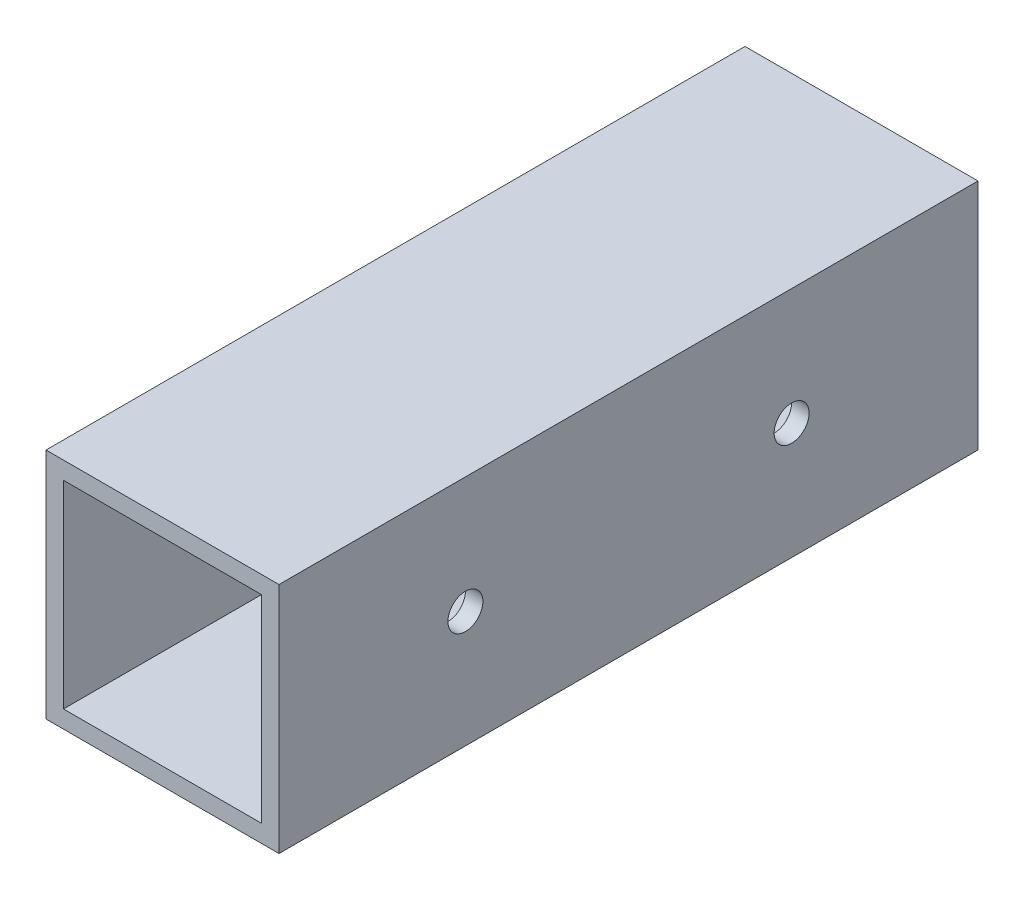
ISO-10303-21;
HEADER;
FILE_DESCRIPTION(('STEP AP214'),'2;1');
FILE_NAME('part.step','',(''),(''),'','','');
FILE_SCHEMA(('AUTOMOTIVE_DESIGN { 1 0 10303 214 1 1 1 1 }'));
ENDSEC;
DATA;
#1=APPLICATION_CONTEXT('core data for automotive mechanical design processes');
#2=APPLICATION_PROTOCOL_DEFINITION('international standard','automotive_design',2000,#1);
#3=PRODUCT_CONTEXT('',#1,'mechanical');
#4=PRODUCT('Part','Part','',(#3));
#5=PRODUCT_RELATED_PRODUCT_CATEGORY('part','',(#4));
#6=PRODUCT_DEFINITION_FORMATION('','',#4);
#7=PRODUCT_DEFINITION_CONTEXT('part definition',#1,'design');
#8=PRODUCT_DEFINITION('design','',#6,#7);
#9=PRODUCT_DEFINITION_SHAPE('','',#8);
#10=(LENGTH_UNIT() NAMED_UNIT(*) SI_UNIT(.MILLI.,.METRE.));
#11=(NAMED_UNIT(*) PLANE_ANGLE_UNIT() SI_UNIT($,.RADIAN.));
#12=(NAMED_UNIT(*) SI_UNIT($,.STERADIAN.) SOLID_ANGLE_UNIT());
#13=UNCERTAINTY_MEASURE_WITH_UNIT(LENGTH_MEASURE(1.E-05),#10,'distance_accuracy_value','');
#14=(GEOMETRIC_REPRESENTATION_CONTEXT(3) GLOBAL_UNCERTAINTY_ASSIGNED_CONTEXT((#13)) GLOBAL_UNIT_ASSIGNED_CONTEXT((#10,
#11,#12)) REPRESENTATION_CONTEXT('',''));
#15=CARTESIAN_POINT('',(0.,0.,0.));
#16=DIRECTION('',(0.,0.,1.));
#17=DIRECTION('',(1.,0.,0.));
#18=AXIS2_PLACEMENT_3D('',#15,#16,#17);
#19=CARTESIAN_POINT('',(0.,0.,60.));
#20=DIRECTION('',(0.,0.,-1.));
#21=DIRECTION('',(-1.,0.,0.));
#22=AXIS2_PLACEMENT_3D('',#19,#20,#21);
#23=PLANE('',#22);
#24=DIRECTION('',(0.,1.,0.));
#25=VECTOR('',#24,1.);
#26=CARTESIAN_POINT('',(10.,-10.,60.));
#27=LINE('',#26,#25);
#28=CARTESIAN_POINT('',(10.,-10.,60.));
#29=VERTEX_POINT('',#28);
#30=CARTESIAN_POINT('',(10.,10.,60.));
#31=VERTEX_POINT('',#30);
#32=EDGE_CURVE('E162',#29,#31,#27,.T.);
#33=ORIENTED_EDGE('',*,*,#32,.T.);
#34=DIRECTION('',(-1.,0.,0.));
#35=VECTOR('',#34,1.);
#36=CARTESIAN_POINT('',(-10.,10.,60.));
#37=LINE('',#36,#35);
#38=CARTESIAN_POINT('',(-10.,10.,60.));
#39=VERTEX_POINT('',#38);
#40=EDGE_CURVE('E166',#31,#39,#37,.T.);
#41=ORIENTED_EDGE('',*,*,#40,.T.);
#42=DIRECTION('',(0.,-1.,0.));
#43=VECTOR('',#42,1.);
#44=CARTESIAN_POINT('',(-10.,-10.,60.));
#45=LINE('',#44,#43);
#46=CARTESIAN_POINT('',(-10.,-10.,60.));
#47=VERTEX_POINT('',#46);
#48=EDGE_CURVE('E170',#39,#47,#45,.T.);
#49=ORIENTED_EDGE('',*,*,#48,.T.);
#50=DIRECTION('',(1.,0.,0.));
#51=VECTOR('',#50,1.);
#52=CARTESIAN_POINT('',(-10.,-10.,60.));
#53=LINE('',#52,#51);
#54=EDGE_CURVE('E173',#47,#29,#53,.T.);
#55=ORIENTED_EDGE('',*,*,#54,.T.);
#56=EDGE_LOOP('',(#33,#41,#49,#55));
#57=FACE_BOUND('',#56,.T.);
#58=DIRECTION('',(1.,0.,0.));
#59=VECTOR('',#58,1.);
#60=CARTESIAN_POINT('',(-8.5,-8.5,60.));
#61=LINE('',#60,#59);
#62=CARTESIAN_POINT('',(-8.5,-8.5,60.));
#63=VERTEX_POINT('',#62);
#64=CARTESIAN_POINT('',(8.5,-8.5,60.));
#65=VERTEX_POINT('',#64);
#66=EDGE_CURVE('E111',#63,#65,#61,.T.);
#67=ORIENTED_EDGE('',*,*,#66,.F.);
#68=DIRECTION('',(0.,-1.,0.));
#69=VECTOR('',#68,1.);
#70=CARTESIAN_POINT('',(-8.5,-8.5,60.));
#71=LINE('',#70,#69);
#72=CARTESIAN_POINT('',(-8.5,8.5,60.));
#73=VERTEX_POINT('',#72);
#74=EDGE_CURVE('E138',#73,#63,#71,.T.);
#75=ORIENTED_EDGE('',*,*,#74,.F.);
#76=DIRECTION('',(-1.,0.,0.));
#77=VECTOR('',#76,1.);
#78=CARTESIAN_POINT('',(-8.5,8.5,60.));
#79=LINE('',#78,#77);
#80=CARTESIAN_POINT('',(8.5,8.5,60.));
#81=VERTEX_POINT('',#80);
#82=EDGE_CURVE('E133',#81,#73,#79,.T.);
#83=ORIENTED_EDGE('',*,*,#82,.F.);
#84=DIRECTION('',(0.,1.,0.));
#85=VECTOR('',#84,1.);
#86=CARTESIAN_POINT('',(8.5,-8.5,60.));
#87=LINE('',#86,#85);
#88=EDGE_CURVE('E120',#65,#81,#87,.T.);
#89=ORIENTED_EDGE('',*,*,#88,.F.);
#90=EDGE_LOOP('',(#67,#75,#83,#89));
#91=FACE_BOUND('',#90,.T.);
#92=ADVANCED_FACE('F23',(#57,#91),#23,.F.);
#93=CARTESIAN_POINT('',(0.,0.,0.));
#94=DIRECTION('',(0.,0.,-1.));
#95=DIRECTION('',(-1.,0.,0.));
#96=AXIS2_PLACEMENT_3D('',#93,#94,#95);
#97=PLANE('',#96);
#98=DIRECTION('',(0.,1.,0.));
#99=VECTOR('',#98,1.);
#100=CARTESIAN_POINT('',(10.,-10.,0.));
#101=LINE('',#100,#99);
#102=CARTESIAN_POINT('',(10.,-10.,0.));
#103=VERTEX_POINT('',#102);
#104=CARTESIAN_POINT('',(10.,10.,0.));
#105=VERTEX_POINT('',#104);
#106=EDGE_CURVE('E129',#103,#105,#101,.T.);
#107=ORIENTED_EDGE('',*,*,#106,.F.);
#108=DIRECTION('',(1.,0.,0.));
#109=VECTOR('',#108,1.);
#110=CARTESIAN_POINT('',(-10.,-10.,0.));
#111=LINE('',#110,#109);
#112=CARTESIAN_POINT('',(-10.,-10.,0.));
#113=VERTEX_POINT('',#112);
#114=EDGE_CURVE('E167',#113,#103,#111,.T.);
#115=ORIENTED_EDGE('',*,*,#114,.F.);
#116=DIRECTION('',(0.,-1.,0.));
#117=VECTOR('',#116,1.);
#118=CARTESIAN_POINT('',(-10.,-10.,0.));
#119=LINE('',#118,#117);
#120=CARTESIAN_POINT('',(-10.,10.,0.));
#121=VERTEX_POINT('',#120);
#122=EDGE_CURVE('E183',#121,#113,#119,.T.);
#123=ORIENTED_EDGE('',*,*,#122,.F.);
#124=DIRECTION('',(-1.,0.,0.));
#125=VECTOR('',#124,1.);
#126=CARTESIAN_POINT('',(-10.,10.,0.));
#127=LINE('',#126,#125);
#128=EDGE_CURVE('E180',#105,#121,#127,.T.);
#129=ORIENTED_EDGE('',*,*,#128,.F.);
#130=EDGE_LOOP('',(#107,#115,#123,#129));
#131=FACE_BOUND('',#130,.T.);
#132=DIRECTION('',(0.,-1.,0.));
#133=VECTOR('',#132,1.);
#134=CARTESIAN_POINT('',(-8.5,-8.5,0.));
#135=LINE('',#134,#133);
#136=CARTESIAN_POINT('',(-8.5,8.5,0.));
#137=VERTEX_POINT('',#136);
#138=CARTESIAN_POINT('',(-8.5,-8.5,0.));
#139=VERTEX_POINT('',#138);
#140=EDGE_CURVE('E121',#137,#139,#135,.T.);
#141=ORIENTED_EDGE('',*,*,#140,.T.);
#142=DIRECTION('',(1.,0.,0.));
#143=VECTOR('',#142,1.);
#144=CARTESIAN_POINT('',(-8.5,-8.5,0.));
#145=LINE('',#144,#143);
#146=CARTESIAN_POINT('',(8.5,-8.5,0.));
#147=VERTEX_POINT('',#146);
#148=EDGE_CURVE('E55',#139,#147,#145,.T.);
#149=ORIENTED_EDGE('',*,*,#148,.T.);
#150=DIRECTION('',(0.,1.,0.));
#151=VECTOR('',#150,1.);
#152=CARTESIAN_POINT('',(8.5,-8.5,0.));
#153=LINE('',#152,#151);
#154=CARTESIAN_POINT('',(8.5,8.5,0.));
#155=VERTEX_POINT('',#154);
#156=EDGE_CURVE('E127',#147,#155,#153,.T.);
#157=ORIENTED_EDGE('',*,*,#156,.T.);
#158=DIRECTION('',(-1.,0.,0.));
#159=VECTOR('',#158,1.);
#160=CARTESIAN_POINT('',(-8.5,8.5,0.));
#161=LINE('',#160,#159);
#162=EDGE_CURVE('E149',#155,#137,#161,.T.);
#163=ORIENTED_EDGE('',*,*,#162,.T.);
#164=EDGE_LOOP('',(#141,#149,#157,#163));
#165=FACE_BOUND('',#164,.T.);
#166=ADVANCED_FACE('F245',(#131,#165),#97,.T.);
#167=CARTESIAN_POINT('',(10.,-10.,60.));
#168=DIRECTION('',(-1.,0.,0.));
#169=DIRECTION('',(0.,0.,1.));
#170=AXIS2_PLACEMENT_3D('',#167,#168,#169);
#171=PLANE('',#170);
#172=CARTESIAN_POINT('',(10.,0.,44.));
#173=DIRECTION('',(1.,0.,0.));
#174=DIRECTION('',(0.,0.,-1.));
#175=AXIS2_PLACEMENT_3D('',#172,#173,#174);
#176=CIRCLE('',#175,1.5);
#177=CARTESIAN_POINT('',(10.,0.,42.5));
#178=VERTEX_POINT('',#177);
#179=EDGE_CURVE('E301',#178,#178,#176,.T.);
#180=ORIENTED_EDGE('',*,*,#179,.F.);
#181=EDGE_LOOP('',(#180));
#182=FACE_BOUND('',#181,.T.);
#183=CARTESIAN_POINT('',(10.,0.,16.));
#184=DIRECTION('',(1.,0.,0.));
#185=DIRECTION('',(0.,0.,-1.));
#186=AXIS2_PLACEMENT_3D('',#183,#184,#185);
#187=CIRCLE('',#186,1.5);
#188=CARTESIAN_POINT('',(10.,0.,14.5));
#189=VERTEX_POINT('',#188);
#190=EDGE_CURVE('E201',#189,#189,#187,.T.);
#191=ORIENTED_EDGE('',*,*,#190,.F.);
#192=EDGE_LOOP('',(#191));
#193=FACE_BOUND('',#192,.T.);
#194=ORIENTED_EDGE('',*,*,#106,.T.);
#195=DIRECTION('',(0.,0.,-1.));
#196=VECTOR('',#195,1.);
#197=CARTESIAN_POINT('',(10.,10.,60.));
#198=LINE('',#197,#196);
#199=EDGE_CURVE('E13',#31,#105,#198,.T.);
#200=ORIENTED_EDGE('',*,*,#199,.F.);
#201=ORIENTED_EDGE('',*,*,#32,.F.);
#202=DIRECTION('',(0.,0.,-1.));
#203=VECTOR('',#202,1.);
#204=CARTESIAN_POINT('',(10.,-10.,60.));
#205=LINE('',#204,#203);
#206=EDGE_CURVE('E176',#29,#103,#205,.T.);
#207=ORIENTED_EDGE('',*,*,#206,.T.);
#208=EDGE_LOOP('',(#194,#200,#201,#207));
#209=FACE_BOUND('',#208,.T.);
#210=ADVANCED_FACE('F25',(#182,#193,#209),#171,.F.);
#211=CARTESIAN_POINT('',(-10.,10.,60.));
#212=DIRECTION('',(0.,-1.,0.));
#213=DIRECTION('',(1.,0.,0.));
#214=AXIS2_PLACEMENT_3D('',#211,#212,#213);
#215=PLANE('',#214);
#216=ORIENTED_EDGE('',*,*,#128,.T.);
#217=DIRECTION('',(0.,0.,-1.));
#218=VECTOR('',#217,1.);
#219=CARTESIAN_POINT('',(-10.,10.,60.));
#220=LINE('',#219,#218);
#221=EDGE_CURVE('E33',#39,#121,#220,.T.);
#222=ORIENTED_EDGE('',*,*,#221,.F.);
#223=ORIENTED_EDGE('',*,*,#40,.F.);
#224=ORIENTED_EDGE('',*,*,#199,.T.);
#225=EDGE_LOOP('',(#216,#222,#223,#224));
#226=FACE_BOUND('',#225,.T.);
#227=ADVANCED_FACE('F261',(#226),#215,.F.);
#228=CARTESIAN_POINT('',(-10.,-10.,60.));
#229=DIRECTION('',(1.,0.,0.));
#230=DIRECTION('',(0.,0.,-1.));
#231=AXIS2_PLACEMENT_3D('',#228,#229,#230);
#232=PLANE('',#231);
#233=CARTESIAN_POINT('',(-10.,0.,44.));
#234=DIRECTION('',(1.,0.,0.));
#235=DIRECTION('',(0.,0.,-1.));
#236=AXIS2_PLACEMENT_3D('',#233,#234,#235);
#237=CIRCLE('',#236,1.5);
#238=CARTESIAN_POINT('',(-10.,0.,42.5));
#239=VERTEX_POINT('',#238);
#240=EDGE_CURVE('E210',#239,#239,#237,.T.);
#241=ORIENTED_EDGE('',*,*,#240,.T.);
#242=EDGE_LOOP('',(#241));
#243=FACE_BOUND('',#242,.T.);
#244=CARTESIAN_POINT('',(-10.,0.,16.));
#245=DIRECTION('',(1.,0.,0.));
#246=DIRECTION('',(0.,0.,-1.));
#247=AXIS2_PLACEMENT_3D('',#244,#245,#246);
#248=CIRCLE('',#247,1.5);
#249=CARTESIAN_POINT('',(-10.,0.,14.5));
#250=VERTEX_POINT('',#249);
#251=EDGE_CURVE('E146',#250,#250,#248,.T.);
#252=ORIENTED_EDGE('',*,*,#251,.T.);
#253=EDGE_LOOP('',(#252));
#254=FACE_BOUND('',#253,.T.);
#255=ORIENTED_EDGE('',*,*,#122,.T.);
#256=DIRECTION('',(0.,0.,-1.));
#257=VECTOR('',#256,1.);
#258=CARTESIAN_POINT('',(-10.,-10.,60.));
#259=LINE('',#258,#257);
#260=EDGE_CURVE('E191',#47,#113,#259,.T.);
#261=ORIENTED_EDGE('',*,*,#260,.F.);
#262=ORIENTED_EDGE('',*,*,#48,.F.);
#263=ORIENTED_EDGE('',*,*,#221,.T.);
#264=EDGE_LOOP('',(#255,#261,#262,#263));
#265=FACE_BOUND('',#264,.T.);
#266=ADVANCED_FACE('F225',(#243,#254,#265),#232,.F.);
#267=CARTESIAN_POINT('',(-10.,-10.,60.));
#268=DIRECTION('',(0.,1.,0.));
#269=DIRECTION('',(-1.,0.,0.));
#270=AXIS2_PLACEMENT_3D('',#267,#268,#269);
#271=PLANE('',#270);
#272=ORIENTED_EDGE('',*,*,#114,.T.);
#273=ORIENTED_EDGE('',*,*,#206,.F.);
#274=ORIENTED_EDGE('',*,*,#54,.F.);
#275=ORIENTED_EDGE('',*,*,#260,.T.);
#276=EDGE_LOOP('',(#272,#273,#274,#275));
#277=FACE_BOUND('',#276,.T.);
#278=ADVANCED_FACE('F256',(#277),#271,.F.);
#279=CARTESIAN_POINT('',(-8.5,-8.5,60.));
#280=DIRECTION('',(0.,1.,0.));
#281=DIRECTION('',(0.,0.,1.));
#282=AXIS2_PLACEMENT_3D('',#279,#280,#281);
#283=PLANE('',#282);
#284=ORIENTED_EDGE('',*,*,#148,.F.);
#285=DIRECTION('',(0.,0.,-1.));
#286=VECTOR('',#285,1.);
#287=CARTESIAN_POINT('',(-8.5,-8.5,60.));
#288=LINE('',#287,#286);
#289=EDGE_CURVE('E115',#63,#139,#288,.T.);
#290=ORIENTED_EDGE('',*,*,#289,.F.);
#291=ORIENTED_EDGE('',*,*,#66,.T.);
#292=DIRECTION('',(0.,0.,-1.));
#293=VECTOR('',#292,1.);
#294=CARTESIAN_POINT('',(8.5,-8.5,60.));
#295=LINE('',#294,#293);
#296=EDGE_CURVE('E114',#65,#147,#295,.T.);
#297=ORIENTED_EDGE('',*,*,#296,.T.);
#298=EDGE_LOOP('',(#284,#290,#291,#297));
#299=FACE_BOUND('',#298,.T.);
#300=ADVANCED_FACE('F113',(#299),#283,.T.);
#301=CARTESIAN_POINT('',(8.5,-8.5,60.));
#302=DIRECTION('',(-1.,0.,0.));
#303=DIRECTION('',(0.,0.,1.));
#304=AXIS2_PLACEMENT_3D('',#301,#302,#303);
#305=PLANE('',#304);
#306=CARTESIAN_POINT('',(8.5,0.,44.));
#307=DIRECTION('',(-1.,0.,0.));
#308=DIRECTION('',(0.,0.,1.));
#309=AXIS2_PLACEMENT_3D('',#306,#307,#308);
#310=CIRCLE('',#309,1.5);
#311=CARTESIAN_POINT('',(8.5,0.,45.5));
#312=VERTEX_POINT('',#311);
#313=EDGE_CURVE('E217',#312,#312,#310,.T.);
#314=ORIENTED_EDGE('',*,*,#313,.F.);
#315=EDGE_LOOP('',(#314));
#316=FACE_BOUND('',#315,.T.);
#317=CARTESIAN_POINT('',(8.5,0.,16.));
#318=DIRECTION('',(-1.,0.,0.));
#319=DIRECTION('',(0.,0.,1.));
#320=AXIS2_PLACEMENT_3D('',#317,#318,#319);
#321=CIRCLE('',#320,1.5);
#322=CARTESIAN_POINT('',(8.5,0.,17.5));
#323=VERTEX_POINT('',#322);
#324=EDGE_CURVE('E200',#323,#323,#321,.T.);
#325=ORIENTED_EDGE('',*,*,#324,.F.);
#326=EDGE_LOOP('',(#325));
#327=FACE_BOUND('',#326,.T.);
#328=ORIENTED_EDGE('',*,*,#156,.F.);
#329=ORIENTED_EDGE('',*,*,#296,.F.);
#330=ORIENTED_EDGE('',*,*,#88,.T.);
#331=DIRECTION('',(0.,0.,-1.));
#332=VECTOR('',#331,1.);
#333=CARTESIAN_POINT('',(8.5,8.5,60.));
#334=LINE('',#333,#332);
#335=EDGE_CURVE('E130',#81,#155,#334,.T.);
#336=ORIENTED_EDGE('',*,*,#335,.T.);
#337=EDGE_LOOP('',(#328,#329,#330,#336));
#338=FACE_BOUND('',#337,.T.);
#339=ADVANCED_FACE('F124',(#316,#327,#338),#305,.T.);
#340=CARTESIAN_POINT('',(-8.5,8.5,60.));
#341=DIRECTION('',(0.,-1.,0.));
#342=DIRECTION('',(0.,0.,-1.));
#343=AXIS2_PLACEMENT_3D('',#340,#341,#342);
#344=PLANE('',#343);
#345=ORIENTED_EDGE('',*,*,#162,.F.);
#346=ORIENTED_EDGE('',*,*,#335,.F.);
#347=ORIENTED_EDGE('',*,*,#82,.T.);
#348=DIRECTION('',(0.,0.,-1.));
#349=VECTOR('',#348,1.);
#350=CARTESIAN_POINT('',(-8.5,8.5,60.));
#351=LINE('',#350,#349);
#352=EDGE_CURVE('E45',#73,#137,#351,.T.);
#353=ORIENTED_EDGE('',*,*,#352,.T.);
#354=EDGE_LOOP('',(#345,#346,#347,#353));
#355=FACE_BOUND('',#354,.T.);
#356=ADVANCED_FACE('F240',(#355),#344,.T.);
#357=CARTESIAN_POINT('',(-8.5,-8.5,60.));
#358=DIRECTION('',(1.,0.,0.));
#359=DIRECTION('',(0.,0.,-1.));
#360=AXIS2_PLACEMENT_3D('',#357,#358,#359);
#361=PLANE('',#360);
#362=CARTESIAN_POINT('',(-8.5,0.,44.));
#363=DIRECTION('',(1.,0.,0.));
#364=DIRECTION('',(0.,0.,-1.));
#365=AXIS2_PLACEMENT_3D('',#362,#363,#364);
#366=CIRCLE('',#365,1.5);
#367=CARTESIAN_POINT('',(-8.5,0.,42.5));
#368=VERTEX_POINT('',#367);
#369=EDGE_CURVE('E27',#368,#368,#366,.T.);
#370=ORIENTED_EDGE('',*,*,#369,.F.);
#371=EDGE_LOOP('',(#370));
#372=FACE_BOUND('',#371,.T.);
#373=CARTESIAN_POINT('',(-8.5,0.,16.));
#374=DIRECTION('',(1.,0.,0.));
#375=DIRECTION('',(0.,0.,-1.));
#376=AXIS2_PLACEMENT_3D('',#373,#374,#375);
#377=CIRCLE('',#376,1.5);
#378=CARTESIAN_POINT('',(-8.5,0.,14.5));
#379=VERTEX_POINT('',#378);
#380=EDGE_CURVE('E197',#379,#379,#377,.T.);
#381=ORIENTED_EDGE('',*,*,#380,.F.);
#382=EDGE_LOOP('',(#381));
#383=FACE_BOUND('',#382,.T.);
#384=ORIENTED_EDGE('',*,*,#140,.F.);
#385=ORIENTED_EDGE('',*,*,#352,.F.);
#386=ORIENTED_EDGE('',*,*,#74,.T.);
#387=ORIENTED_EDGE('',*,*,#289,.T.);
#388=EDGE_LOOP('',(#384,#385,#386,#387));
#389=FACE_BOUND('',#388,.T.);
#390=ADVANCED_FACE('F231',(#372,#383,#389),#361,.T.);
#391=CARTESIAN_POINT('',(-20.,0.,16.));
#392=DIRECTION('',(1.,0.,0.));
#393=DIRECTION('',(0.,0.,-1.));
#394=AXIS2_PLACEMENT_3D('',#391,#392,#393);
#395=CYLINDRICAL_SURFACE('',#394,1.5);
#396=ORIENTED_EDGE('',*,*,#380,.T.);
#397=EDGE_LOOP('',(#396));
#398=FACE_BOUND('',#397,.T.);
#399=ORIENTED_EDGE('',*,*,#251,.F.);
#400=EDGE_LOOP('',(#399));
#401=FACE_BOUND('',#400,.T.);
#402=ADVANCED_FACE('F228',(#398,#401),#395,.F.);
#403=ORIENTED_EDGE('',*,*,#324,.T.);
#404=EDGE_LOOP('',(#403));
#405=FACE_BOUND('',#404,.T.);
#406=ORIENTED_EDGE('',*,*,#190,.T.);
#407=EDGE_LOOP('',(#406));
#408=FACE_BOUND('',#407,.T.);
#409=ADVANCED_FACE('F230',(#405,#408),#395,.F.);
#410=CARTESIAN_POINT('',(-20.,0.,44.));
#411=DIRECTION('',(1.,0.,0.));
#412=DIRECTION('',(0.,0.,-1.));
#413=AXIS2_PLACEMENT_3D('',#410,#411,#412);
#414=CYLINDRICAL_SURFACE('',#413,1.5);
#415=ORIENTED_EDGE('',*,*,#369,.T.);
#416=EDGE_LOOP('',(#415));
#417=FACE_BOUND('',#416,.T.);
#418=ORIENTED_EDGE('',*,*,#240,.F.);
#419=EDGE_LOOP('',(#418));
#420=FACE_BOUND('',#419,.T.);
#421=ADVANCED_FACE('F238',(#417,#420),#414,.F.);
#422=ORIENTED_EDGE('',*,*,#313,.T.);
#423=EDGE_LOOP('',(#422));
#424=FACE_BOUND('',#423,.T.);
#425=ORIENTED_EDGE('',*,*,#179,.T.);
#426=EDGE_LOOP('',(#425));
#427=FACE_BOUND('',#426,.T.);
#428=ADVANCED_FACE('F309',(#424,#427),#414,.F.);
#429=CLOSED_SHELL('',(#92,#166,#210,#227,#266,#278,#300,#339,#356,#390,#402,#409,#421,#428));
#430=MANIFOLD_SOLID_BREP('B1',#429);
#431=ADVANCED_BREP_SHAPE_REPRESENTATION('',(#18,#430),#14);
#432=SHAPE_DEFINITION_REPRESENTATION(#9,#431);
ENDSEC;
END-ISO-10303-21;
